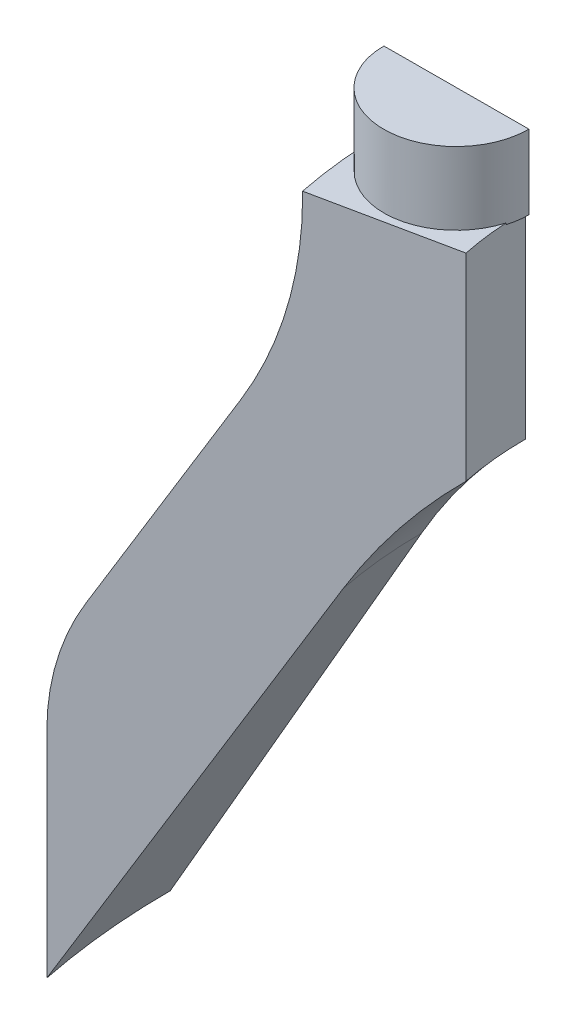
ISO-10303-21;
HEADER;
FILE_DESCRIPTION(('STEP AP214'),'2;1');
FILE_NAME('part.step','',(''),(''),'','','');
FILE_SCHEMA(('AUTOMOTIVE_DESIGN { 1 0 10303 214 1 1 1 1 }'));
ENDSEC;
DATA;
#1=APPLICATION_CONTEXT('core data for automotive mechanical design processes');
#2=APPLICATION_PROTOCOL_DEFINITION('international standard','automotive_design',2000,#1);
#3=PRODUCT_CONTEXT('',#1,'mechanical');
#4=PRODUCT('Part','Part','',(#3));
#5=PRODUCT_RELATED_PRODUCT_CATEGORY('part','',(#4));
#6=PRODUCT_DEFINITION_FORMATION('','',#4);
#7=PRODUCT_DEFINITION_CONTEXT('part definition',#1,'design');
#8=PRODUCT_DEFINITION('design','',#6,#7);
#9=PRODUCT_DEFINITION_SHAPE('','',#8);
#10=(LENGTH_UNIT() NAMED_UNIT(*) SI_UNIT(.MILLI.,.METRE.));
#11=(NAMED_UNIT(*) PLANE_ANGLE_UNIT() SI_UNIT($,.RADIAN.));
#12=(NAMED_UNIT(*) SI_UNIT($,.STERADIAN.) SOLID_ANGLE_UNIT());
#13=UNCERTAINTY_MEASURE_WITH_UNIT(LENGTH_MEASURE(1.E-05),#10,'distance_accuracy_value','');
#14=(GEOMETRIC_REPRESENTATION_CONTEXT(3) GLOBAL_UNCERTAINTY_ASSIGNED_CONTEXT((#13)) GLOBAL_UNIT_ASSIGNED_CONTEXT((#10,
#11,#12)) REPRESENTATION_CONTEXT('',''));
#15=CARTESIAN_POINT('',(0.,0.,0.));
#16=DIRECTION('',(0.,0.,1.));
#17=DIRECTION('',(1.,0.,0.));
#18=AXIS2_PLACEMENT_3D('',#15,#16,#17);
#19=CARTESIAN_POINT('',(-14.0443260313393,13.952590942658,5.93340198483997));
#20=DIRECTION('',(0.199367934417198,0.,0.97992470462083));
#21=DIRECTION('',(0.97992470462083,0.,-0.199367934417198));
#22=AXIS2_PLACEMENT_3D('',#19,#20,#21);
#23=PLANE('',#22);
#24=CARTESIAN_POINT('',(-14.0443260313393,13.952590942658,5.93340198483997));
#25=DIRECTION('',(-0.199367934417198,0.,-0.97992470462083));
#26=DIRECTION('',(0.97992470462083,0.,-0.199367934417198));
#27=AXIS2_PLACEMENT_3D('',#24,#25,#26);
#28=CIRCLE('',#27,13.5);
#29=CARTESIAN_POINT('',(-0.815342518958123,13.952590942658,3.24193487020781));
#30=VERTEX_POINT('',#29);
#31=CARTESIAN_POINT('',(-2.58696094719064,7.20388016302837,3.60237471313311));
#32=VERTEX_POINT('',#31);
#33=EDGE_CURVE('E304',#30,#32,#28,.T.);
#34=ORIENTED_EDGE('',*,*,#33,.T.);
#35=DIRECTION('',(-0.489868771651852,-0.866080532447982,0.0996649280084325));
#36=VECTOR('',#35,1.);
#37=CARTESIAN_POINT('',(-2.58696094719064,7.20388016302837,3.60237471313311));
#38=LINE('',#37,#36);
#39=CARTESIAN_POINT('',(-7.02866248836264,-0.648980558796179,4.50604910503835));
#40=VERTEX_POINT('',#39);
#41=EDGE_CURVE('E328',#32,#40,#38,.T.);
#42=ORIENTED_EDGE('',*,*,#41,.T.);
#43=CARTESIAN_POINT('',(0.185234046101336,-4.89816882745189,3.03836526729699));
#44=DIRECTION('',(0.199367934417198,0.,0.97992470462083));
#45=DIRECTION('',(0.97992470462083,0.,-0.199367934417198));
#46=AXIS2_PLACEMENT_3D('',#43,#44,#45);
#47=CIRCLE('',#46,8.5);
#48=CARTESIAN_POINT('',(-8.14412594317571,-4.89816882745189,4.73299270984317));
#49=VERTEX_POINT('',#48);
#50=EDGE_CURVE('E325',#40,#49,#47,.T.);
#51=ORIENTED_EDGE('',*,*,#50,.T.);
#52=DIRECTION('',(0.,-1.,0.));
#53=VECTOR('',#52,1.);
#54=CARTESIAN_POINT('',(-8.14412594317572,-4.89816882745189,4.73299270984317));
#55=LINE('',#54,#53);
#56=CARTESIAN_POINT('',(-8.14412594317572,-12.2823034578324,4.73299270984317));
#57=VERTEX_POINT('',#56);
#58=EDGE_CURVE('E322',#49,#57,#55,.T.);
#59=ORIENTED_EDGE('',*,*,#58,.T.);
#60=DIRECTION('',(0.48986877165185,0.866080532447983,-0.0996649280084321));
#61=VECTOR('',#60,1.);
#62=CARTESIAN_POINT('',(-8.14412594317572,-12.2823034578324,4.73299270984317));
#63=LINE('',#62,#61);
#64=CARTESIAN_POINT('',(0.34778871953757,2.7312724183872,3.00529314520432));
#65=VERTEX_POINT('',#64);
#66=EDGE_CURVE('E319',#57,#65,#63,.T.);
#67=ORIENTED_EDGE('',*,*,#66,.T.);
#68=CARTESIAN_POINT('',(18.2742726721109,-7.82793160479309,-0.641891235528776));
#69=DIRECTION('',(-0.199367934417198,0.,-0.97992470462083));
#70=DIRECTION('',(0.97992470462083,0.,-0.199367934417198));
#71=AXIS2_PLACEMENT_3D('',#68,#69,#70);
#72=CIRCLE('',#71,21.1224423401291);
#73=CARTESIAN_POINT('',(3.86601856956697,7.33672211900116,2.28950119231474));
#74=VERTEX_POINT('',#73);
#75=EDGE_CURVE('E316',#65,#74,#72,.T.);
#76=ORIENTED_EDGE('',*,*,#75,.T.);
#77=DIRECTION('',(0.,1.,0.));
#78=VECTOR('',#77,1.);
#79=CARTESIAN_POINT('',(3.86601856956697,7.33672211900116,2.28950119231474));
#80=LINE('',#79,#78);
#81=CARTESIAN_POINT('',(3.86601856956696,14.1500494040971,2.28950119231474));
#82=VERTEX_POINT('',#81);
#83=EDGE_CURVE('E311',#74,#82,#80,.T.);
#84=ORIENTED_EDGE('',*,*,#83,.T.);
#85=DIRECTION('',(-0.979919727516482,-0.00318717907963364,0.199366921813874));
#86=VECTOR('',#85,1.);
#87=CARTESIAN_POINT('',(3.86601856956696,14.1500494040971,2.28950119231474));
#88=LINE('',#87,#86);
#89=CARTESIAN_POINT('',(-0.815342518958123,14.1348233241371,3.24193487020781));
#90=VERTEX_POINT('',#89);
#91=EDGE_CURVE('E309',#82,#90,#88,.T.);
#92=ORIENTED_EDGE('',*,*,#91,.T.);
#93=DIRECTION('',(0.,-1.,0.));
#94=VECTOR('',#93,1.);
#95=CARTESIAN_POINT('',(-0.815342518958123,14.1348233241371,3.24193487020781));
#96=LINE('',#95,#94);
#97=EDGE_CURVE('E306',#90,#30,#96,.T.);
#98=ORIENTED_EDGE('',*,*,#97,.T.);
#99=EDGE_LOOP('',(#34,#42,#51,#59,#67,#76,#84,#92,#98));
#100=FACE_BOUND('',#99,.T.);
#101=ADVANCED_FACE('F34',(#100),#23,.T.);
#102=CARTESIAN_POINT('',(15.1192764526186,13.952590942658,0.));
#103=DIRECTION('',(0.,1.,0.));
#104=DIRECTION('',(-1.,0.,0.));
#105=AXIS2_PLACEMENT_3D('',#102,#103,#104);
#106=TOROIDAL_SURFACE('',#105,29.7610646475562,13.5);
#107=CARTESIAN_POINT('',(-14.6417881949376,13.952590942658,0.));
#108=DIRECTION('',(0.,0.,1.));
#109=DIRECTION('',(1.,0.,0.));
#110=AXIS2_PLACEMENT_3D('',#107,#108,#109);
#111=CIRCLE('',#110,13.5);
#112=CARTESIAN_POINT('',(-2.94970100688985,7.20388016302838,0.));
#113=VERTEX_POINT('',#112);
#114=CARTESIAN_POINT('',(-1.1417881949376,13.952590942658,0.));
#115=VERTEX_POINT('',#114);
#116=EDGE_CURVE('E280',#113,#115,#111,.T.);
#117=ORIENTED_EDGE('',*,*,#116,.F.);
#118=CARTESIAN_POINT('',(15.1192764526186,7.20388016302837,0.));
#119=DIRECTION('',(0.,1.,0.));
#120=DIRECTION('',(-1.,0.,0.));
#121=AXIS2_PLACEMENT_3D('',#118,#119,#120);
#122=CIRCLE('',#121,18.0689774595085);
#123=EDGE_CURVE('E164',#113,#32,#122,.T.);
#124=ORIENTED_EDGE('',*,*,#123,.T.);
#125=ORIENTED_EDGE('',*,*,#33,.F.);
#126=CARTESIAN_POINT('',(15.1192764526186,13.952590942658,0.));
#127=DIRECTION('',(0.,1.,0.));
#128=DIRECTION('',(-1.,0.,0.));
#129=AXIS2_PLACEMENT_3D('',#126,#127,#128);
#130=CIRCLE('',#129,16.2610646475562);
#131=EDGE_CURVE('E162',#115,#30,#130,.T.);
#132=ORIENTED_EDGE('',*,*,#131,.F.);
#133=EDGE_LOOP('',(#117,#124,#125,#132));
#134=FACE_BOUND('',#133,.T.);
#135=ADVANCED_FACE('F230',(#134),#106,.F.);
#136=CARTESIAN_POINT('',(15.1192764526186,7.20388016302837,0.));
#137=DIRECTION('',(0.,-1.,0.));
#138=DIRECTION('',(1.,0.,0.));
#139=AXIS2_PLACEMENT_3D('',#136,#137,#138);
#140=CONICAL_SURFACE('',#139,18.0689774595085,0.523488507740985);
#141=DIRECTION('',(-0.499904502194789,-0.866080532447982,0.));
#142=VECTOR('',#141,1.);
#143=CARTESIAN_POINT('',(15.1192764526186,38.5082383958813,0.));
#144=LINE('',#143,#142);
#145=CARTESIAN_POINT('',(-7.48239777453657,-0.648980558796178,0.));
#146=VERTEX_POINT('',#145);
#147=EDGE_CURVE('E296',#146,#113,#144,.F.);
#148=ORIENTED_EDGE('',*,*,#147,.F.);
#149=CARTESIAN_POINT('',(15.1192764526186,-0.648980558796186,0.));
#150=DIRECTION('',(0.,1.,0.));
#151=DIRECTION('',(-1.,0.,0.));
#152=AXIS2_PLACEMENT_3D('',#149,#150,#151);
#153=CIRCLE('',#152,22.6016742271552);
#154=EDGE_CURVE('E468',#146,#40,#153,.T.);
#155=ORIENTED_EDGE('',*,*,#154,.T.);
#156=ORIENTED_EDGE('',*,*,#41,.F.);
#157=ORIENTED_EDGE('',*,*,#123,.F.);
#158=EDGE_LOOP('',(#148,#155,#156,#157));
#159=FACE_BOUND('',#158,.T.);
#160=ADVANCED_FACE('F227',(#159),#140,.T.);
#161=CARTESIAN_POINT('',(15.1192764526186,-4.8981688274519,0.));
#162=DIRECTION('',(0.,1.,0.));
#163=DIRECTION('',(-1.,0.,0.));
#164=AXIS2_PLACEMENT_3D('',#161,#162,#163);
#165=TOROIDAL_SURFACE('',#164,15.2399897013474,8.5);
#166=CARTESIAN_POINT('',(-0.120713248728728,-4.89816882745189,0.));
#167=DIRECTION('',(0.,0.,1.));
#168=DIRECTION('',(1.,0.,0.));
#169=AXIS2_PLACEMENT_3D('',#166,#167,#168);
#170=CIRCLE('',#169,8.5);
#171=CARTESIAN_POINT('',(-8.62071324872872,-4.89816882745189,0.));
#172=VERTEX_POINT('',#171);
#173=EDGE_CURVE('E293',#172,#146,#170,.F.);
#174=ORIENTED_EDGE('',*,*,#173,.F.);
#175=CARTESIAN_POINT('',(15.1192764526186,-4.8981688274519,0.));
#176=DIRECTION('',(0.,1.,0.));
#177=DIRECTION('',(-1.,0.,0.));
#178=AXIS2_PLACEMENT_3D('',#175,#176,#177);
#179=CIRCLE('',#178,23.7399897013474);
#180=EDGE_CURVE('E466',#172,#49,#179,.T.);
#181=ORIENTED_EDGE('',*,*,#180,.T.);
#182=ORIENTED_EDGE('',*,*,#50,.F.);
#183=ORIENTED_EDGE('',*,*,#154,.F.);
#184=EDGE_LOOP('',(#174,#181,#182,#183));
#185=FACE_BOUND('',#184,.T.);
#186=ADVANCED_FACE('F223',(#185),#165,.T.);
#187=CARTESIAN_POINT('',(15.1192764526186,-4.16703048843534,0.));
#188=DIRECTION('',(0.,1.,0.));
#189=DIRECTION('',(-1.,0.,0.));
#190=AXIS2_PLACEMENT_3D('',#187,#188,#189);
#191=CYLINDRICAL_SURFACE('',#190,23.7399897013474);
#192=DIRECTION('',(0.,1.,0.));
#193=VECTOR('',#192,1.);
#194=CARTESIAN_POINT('',(-8.62071324872872,-4.16703048843533,0.));
#195=LINE('',#194,#193);
#196=CARTESIAN_POINT('',(-8.62071324872873,-12.2823034578324,0.));
#197=VERTEX_POINT('',#196);
#198=EDGE_CURVE('E290',#197,#172,#195,.T.);
#199=ORIENTED_EDGE('',*,*,#198,.F.);
#200=CARTESIAN_POINT('',(15.1192764526186,-12.2823034578325,0.));
#201=DIRECTION('',(0.,1.,0.));
#202=DIRECTION('',(-1.,0.,0.));
#203=AXIS2_PLACEMENT_3D('',#200,#201,#202);
#204=CIRCLE('',#203,23.7399897013474);
#205=EDGE_CURVE('E335',#197,#57,#204,.T.);
#206=ORIENTED_EDGE('',*,*,#205,.T.);
#207=ORIENTED_EDGE('',*,*,#58,.F.);
#208=ORIENTED_EDGE('',*,*,#180,.F.);
#209=EDGE_LOOP('',(#199,#206,#207,#208));
#210=FACE_BOUND('',#209,.T.);
#211=ADVANCED_FACE('F219',(#210),#191,.T.);
#212=CARTESIAN_POINT('',(15.1192764526186,-12.2823034578325,0.));
#213=DIRECTION('',(0.,-1.,0.));
#214=DIRECTION('',(1.,0.,0.));
#215=AXIS2_PLACEMENT_3D('',#212,#213,#214);
#216=CONICAL_SURFACE('',#215,23.7399897013474,0.523488507740983);
#217=DIRECTION('',(-0.499904502194787,-0.866080532447983,0.));
#218=VECTOR('',#217,1.);
#219=CARTESIAN_POINT('',(15.1192764526186,28.8470379075332,0.));
#220=LINE('',#219,#218);
#221=CARTESIAN_POINT('',(0.0451716122914191,2.7312724183872,0.));
#222=VERTEX_POINT('',#221);
#223=EDGE_CURVE('E287',#222,#197,#220,.T.);
#224=ORIENTED_EDGE('',*,*,#223,.F.);
#225=CARTESIAN_POINT('',(15.1192764526186,2.7312724183872,0.));
#226=DIRECTION('',(0.,1.,0.));
#227=DIRECTION('',(-1.,0.,0.));
#228=AXIS2_PLACEMENT_3D('',#225,#226,#227);
#229=CIRCLE('',#228,15.0741048403272);
#230=EDGE_CURVE('E332',#222,#65,#229,.T.);
#231=ORIENTED_EDGE('',*,*,#230,.T.);
#232=ORIENTED_EDGE('',*,*,#66,.F.);
#233=ORIENTED_EDGE('',*,*,#205,.F.);
#234=EDGE_LOOP('',(#224,#231,#232,#233));
#235=FACE_BOUND('',#234,.T.);
#236=ADVANCED_FACE('F215',(#235),#216,.F.);
#237=CARTESIAN_POINT('',(15.1192764526186,-7.82793160479308,0.));
#238=DIRECTION('',(0.,1.,0.));
#239=DIRECTION('',(-1.,0.,0.));
#240=AXIS2_PLACEMENT_3D('',#237,#238,#239);
#241=DEGENERATE_TOROIDAL_SURFACE('',#240,3.21963126821365,21.1224423401291,.F.);
#242=CARTESIAN_POINT('',(18.3389077208323,-7.82793160479309,0.));
#243=DIRECTION('',(0.,0.,1.));
#244=DIRECTION('',(1.,0.,0.));
#245=AXIS2_PLACEMENT_3D('',#242,#243,#244);
#246=CIRCLE('',#245,21.1224423401291);
#247=CARTESIAN_POINT('',(3.63547792198971,7.33672211900116,0.));
#248=VERTEX_POINT('',#247);
#249=EDGE_CURVE('E284',#248,#222,#246,.T.);
#250=ORIENTED_EDGE('',*,*,#249,.F.);
#251=CARTESIAN_POINT('',(15.1192764526186,7.33672211900116,0.));
#252=DIRECTION('',(0.,1.,0.));
#253=DIRECTION('',(-1.,0.,0.));
#254=AXIS2_PLACEMENT_3D('',#251,#252,#253);
#255=CIRCLE('',#254,11.4837985306289);
#256=EDGE_CURVE('E330',#248,#74,#255,.T.);
#257=ORIENTED_EDGE('',*,*,#256,.T.);
#258=ORIENTED_EDGE('',*,*,#75,.F.);
#259=ORIENTED_EDGE('',*,*,#230,.F.);
#260=EDGE_LOOP('',(#250,#257,#258,#259));
#261=FACE_BOUND('',#260,.T.);
#262=ADVANCED_FACE('F211',(#261),#241,.T.);
#263=CARTESIAN_POINT('',(15.1192764526186,-4.16703048843534,0.));
#264=DIRECTION('',(0.,1.,0.));
#265=DIRECTION('',(-1.,0.,0.));
#266=AXIS2_PLACEMENT_3D('',#263,#264,#265);
#267=CYLINDRICAL_SURFACE('',#266,11.4837985306289);
#268=DIRECTION('',(0.,1.,0.));
#269=VECTOR('',#268,1.);
#270=CARTESIAN_POINT('',(3.6354779219897,-4.16703048843533,0.));
#271=LINE('',#270,#269);
#272=CARTESIAN_POINT('',(3.63547792198971,14.0970312821419,0.));
#273=VERTEX_POINT('',#272);
#274=EDGE_CURVE('E268',#273,#248,#271,.F.);
#275=ORIENTED_EDGE('',*,*,#274,.F.);
#276=CARTESIAN_POINT('',(15.1192764526186,14.1366480363215,0.));
#277=DIRECTION('',(0.00344977477050115,-0.999994049509312,0.));
#278=DIRECTION('',(0.999994049509312,0.00344977477050115,0.));
#279=AXIS2_PLACEMENT_3D('',#276,#277,#278);
#280=ELLIPSE('',#279,11.4838668652718,11.4837985306289);
#281=CARTESIAN_POINT('',(3.65672291104021,14.0971045730052,0.698208420547166));
#282=VERTEX_POINT('',#281);
#283=EDGE_CURVE('E156',#282,#273,#280,.T.);
#284=ORIENTED_EDGE('',*,*,#283,.F.);
#285=CARTESIAN_POINT('',(3.65672291104022,14.0971045730052,0.698208420547138));
#286=CARTESIAN_POINT('',(3.65671763983898,14.1059287118589,0.698121882751777));
#287=CARTESIAN_POINT('',(3.6567123685723,14.1147528505434,0.698035327714555));
#288=CARTESIAN_POINT('',(3.65670182590807,14.1324011275741,0.697862183156388));
#289=CARTESIAN_POINT('',(3.65669655451051,14.1412252659202,0.697775593635443));
#290=CARTESIAN_POINT('',(3.65669128304752,14.1500494040971,0.697688986872637));
#291=B_SPLINE_CURVE_WITH_KNOTS('',3,(#285,#286,#287,#288,#289,#290),.UNSPECIFIED.,.F.,.F.,(4,2,
4),(0.,0.0264736942597354,0.0529473885194714),.UNSPECIFIED.);
#292=CARTESIAN_POINT('',(3.65669128304962,14.1500494040971,0.697688986873042));
#293=VERTEX_POINT('',#292);
#294=EDGE_CURVE('E187',#282,#293,#291,.T.);
#295=ORIENTED_EDGE('',*,*,#294,.T.);
#296=CARTESIAN_POINT('',(15.1192764526186,14.1500494040971,0.));
#297=DIRECTION('',(0.,1.,0.));
#298=DIRECTION('',(-1.,0.,0.));
#299=AXIS2_PLACEMENT_3D('',#296,#297,#298);
#300=CIRCLE('',#299,11.4837985306289);
#301=EDGE_CURVE('E202',#293,#82,#300,.T.);
#302=ORIENTED_EDGE('',*,*,#301,.T.);
#303=ORIENTED_EDGE('',*,*,#83,.F.);
#304=ORIENTED_EDGE('',*,*,#256,.F.);
#305=EDGE_LOOP('',(#275,#284,#295,#302,#303,#304));
#306=FACE_BOUND('',#305,.T.);
#307=ADVANCED_FACE('F206',(#306),#267,.F.);
#308=CARTESIAN_POINT('',(15.1192764526186,14.1500494040971,0.));
#309=DIRECTION('',(0.,-1.,0.));
#310=DIRECTION('',(1.,0.,0.));
#311=AXIS2_PLACEMENT_3D('',#308,#309,#310);
#312=CONICAL_SURFACE('',#311,11.4837985306289,1.56760914231928);
#313=CARTESIAN_POINT('',(3.70872661330898,14.1502501654011,0.483963593978391));
#314=CARTESIAN_POINT('',(3.69512143370419,14.1501975459827,0.552949417201797));
#315=CARTESIAN_POINT('',(3.67859332770948,14.1501336996225,0.621355233227295));
#316=CARTESIAN_POINT('',(3.63983854826314,14.1499845388329,0.756529694868395));
#317=CARTESIAN_POINT('',(3.61761214767996,14.1498992254315,0.823298418710074));
#318=CARTESIAN_POINT('',(3.56762426409411,14.1497081781471,0.954682160759539));
#319=CARTESIAN_POINT('',(3.53986667290977,14.1496024586238,1.01929865620213));
#320=CARTESIAN_POINT('',(3.47902267781401,14.1493718963824,1.14594961093553));
#321=CARTESIAN_POINT('',(3.44593633865288,14.1492470538967,1.20798410158909));
#322=CARTESIAN_POINT('',(3.33897306200325,14.1488457701396,1.38960778391637));
#323=CARTESIAN_POINT('',(3.25737064469452,14.1485424905611,1.5047728124125));
#324=CARTESIAN_POINT('',(3.07604753373708,14.1478782203842,1.71968023258093));
#325=CARTESIAN_POINT('',(2.97633043248668,14.1475172412301,1.81942567492879));
#326=CARTESIAN_POINT('',(2.76155384301796,14.146751832364,2.00078085168342));
#327=CARTESIAN_POINT('',(2.64649404266331,14.1463474017681,2.08239021703448));
#328=CARTESIAN_POINT('',(2.40429119020176,14.1455098089904,2.22514188951392));
#329=CARTESIAN_POINT('',(2.27714623868329,14.1450766422955,2.28628097249593));
#330=CARTESIAN_POINT('',(2.01440037941292,14.144195954392,2.38634292100166));
#331=CARTESIAN_POINT('',(1.87879979773481,14.1437484337372,2.42526664262763));
#332=CARTESIAN_POINT('',(1.60299979744779,14.1428524755406,2.47979262163742));
#333=CARTESIAN_POINT('',(1.46280075040167,14.1424040380756,2.49539675855723));
#334=CARTESIAN_POINT('',(1.18177195796997,14.1415184508091,2.5028471014302));
#335=CARTESIAN_POINT('',(1.04094220916293,14.141081301069,2.4946931783434));
#336=CARTESIAN_POINT('',(0.762640556412933,14.1402292082836,2.45485704074626));
#337=CARTESIAN_POINT('',(0.62516888724508,14.1398142667887,2.42317318601114));
#338=CARTESIAN_POINT('',(0.357494185696131,14.1390162259711,2.33717412610578));
#339=CARTESIAN_POINT('',(0.227291268259442,14.1386331271518,2.28285856316391));
#340=CARTESIAN_POINT('',(-0.0221346213167079,14.1379070946838,2.15314456225611));
#341=CARTESIAN_POINT('',(-0.141358700430547,14.1375641569847,2.07774825292074));
#342=CARTESIAN_POINT('',(-0.36546345948298,14.1369253675589,1.9080060784989));
#343=CARTESIAN_POINT('',(-0.47034333288486,14.1366295184798,1.8136591486049));
#344=CARTESIAN_POINT('',(-0.662775490766124,14.1360906575898,1.6086964253335));
#345=CARTESIAN_POINT('',(-0.750327967741547,14.135847645192,1.49808081271432));
#346=CARTESIAN_POINT('',(-0.896796916288798,14.1354433377759,1.27703106877934));
#347=CARTESIAN_POINT('',(-0.957836171693532,14.1352758969565,1.16800265591048));
#348=CARTESIAN_POINT('',(-1.03667999953561,14.1350603781431,0.998655660830308));
#349=CARTESIAN_POINT('',(-1.06084571969366,14.134994469166,0.941226998274327));
#350=CARTESIAN_POINT('',(-1.10482864598556,14.1348747024078,0.824720190427643));
#351=CARTESIAN_POINT('',(-1.12464534106784,14.1348208460431,0.765641852202934));
#352=CARTESIAN_POINT('',(-1.14223309437237,14.1347730992375,0.705885082353684));
#353=B_SPLINE_CURVE_WITH_KNOTS('',3,(#313,#314,#315,#316,#317,#318,#319,#320,#321,#322,#323,
#324,#325,#326,#327,#328,#329,#330,#331,#332,#333,#334,#335,#336,#337,#338,#339,#340,#341,#342,
#343,#344,#345,#346,#347,#348,#349,#350,#351,#352),.UNSPECIFIED.,.F.,.F.,(4,2,2,2,2,2,2,2,2,2,2,
2,2,2,2,2,2,2,2,4),(0.,0.210875294626943,0.421740493168285,0.632457844767324,0.843172636106629,
1.2644258585558,1.6855956315449,2.10677397424182,2.52801862293774,2.94924703724357,
3.37044149911498,3.79163824867373,4.21286436177706,4.63409713405385,5.05528738765901,
5.47650131394946,5.89771056056604,6.27108994496157,6.45785560695896,6.64464320395044),.UNSPECIFIED.);
#354=CARTESIAN_POINT('',(-1.12374017524904,14.1348233241371,0.765920556466206));
#355=VERTEX_POINT('',#354);
#356=EDGE_CURVE('E166',#293,#355,#353,.T.);
#357=ORIENTED_EDGE('',*,*,#356,.T.);
#358=CARTESIAN_POINT('',(15.1192764526186,14.1348233241371,0.));
#359=DIRECTION('',(0.,1.,0.));
#360=DIRECTION('',(-1.,0.,0.));
#361=AXIS2_PLACEMENT_3D('',#358,#359,#360);
#362=CIRCLE('',#361,16.2610646475562);
#363=EDGE_CURVE('E161',#355,#90,#362,.T.);
#364=ORIENTED_EDGE('',*,*,#363,.T.);
#365=ORIENTED_EDGE('',*,*,#91,.F.);
#366=ORIENTED_EDGE('',*,*,#301,.F.);
#367=EDGE_LOOP('',(#357,#364,#365,#366));
#368=FACE_BOUND('',#367,.T.);
#369=ADVANCED_FACE('F203',(#368),#312,.T.);
#370=CARTESIAN_POINT('',(15.1192764526186,-4.16703048843534,0.));
#371=DIRECTION('',(0.,1.,0.));
#372=DIRECTION('',(-1.,0.,0.));
#373=AXIS2_PLACEMENT_3D('',#370,#371,#372);
#374=CYLINDRICAL_SURFACE('',#373,16.2610646475562);
#375=DIRECTION('',(0.,1.,0.));
#376=VECTOR('',#375,1.);
#377=CARTESIAN_POINT('',(-1.14178819493761,-4.16703048843533,0.));
#378=LINE('',#377,#376);
#379=CARTESIAN_POINT('',(-1.1417881949376,14.0805506919521,0.));
#380=VERTEX_POINT('',#379);
#381=EDGE_CURVE('E274',#115,#380,#378,.T.);
#382=ORIENTED_EDGE('',*,*,#381,.F.);
#383=ORIENTED_EDGE('',*,*,#131,.T.);
#384=ORIENTED_EDGE('',*,*,#97,.F.);
#385=ORIENTED_EDGE('',*,*,#363,.F.);
#386=CARTESIAN_POINT('',(-1.12374017524904,14.1348233241371,0.765920556466206));
#387=CARTESIAN_POINT('',(-1.12374552575798,14.1257882432647,0.765807087274633));
#388=CARTESIAN_POINT('',(-1.12375087640791,14.116753162748,0.76569358978383));
#389=CARTESIAN_POINT('',(-1.12376157798977,14.0986830024259,0.765466538203765));
#390=CARTESIAN_POINT('',(-1.1237669289217,14.0896479226205,0.765352984114503));
#391=CARTESIAN_POINT('',(-1.12377227999463,14.0806128431708,0.765239401726012));
#392=B_SPLINE_CURVE_WITH_KNOTS('',3,(#386,#387,#388,#389,#390,#391),.UNSPECIFIED.,.F.,.F.,(4,2,
4),(0.,0.0271073848292365,0.0542147696584726),.UNSPECIFIED.);
#393=CARTESIAN_POINT('',(-1.12377227999463,14.0806128431708,0.765239401725932));
#394=VERTEX_POINT('',#393);
#395=EDGE_CURVE('E152',#355,#394,#392,.T.);
#396=ORIENTED_EDGE('',*,*,#395,.T.);
#397=CARTESIAN_POINT('',(15.1192764526186,14.1366480363215,0.));
#398=DIRECTION('',(0.00344977477050115,-0.999994049509312,0.));
#399=DIRECTION('',(0.999994049509312,0.00344977477050115,0.));
#400=AXIS2_PLACEMENT_3D('',#397,#398,#399);
#401=ELLIPSE('',#400,16.2611614094458,16.2610646475562);
#402=EDGE_CURVE('E136',#380,#394,#401,.F.);
#403=ORIENTED_EDGE('',*,*,#402,.F.);
#404=EDGE_LOOP('',(#382,#383,#384,#385,#396,#403));
#405=FACE_BOUND('',#404,.T.);
#406=ADVANCED_FACE('F159',(#405),#374,.T.);
#407=CARTESIAN_POINT('',(1.25621537674327,14.0888233133994,0.));
#408=DIRECTION('',(0.00344977477050115,-0.999994049509312,0.));
#409=DIRECTION('',(0.999994049509312,0.00344977477050115,0.));
#410=AXIS2_PLACEMENT_3D('',#407,#408,#409);
#411=PLANE('',#410);
#412=DIRECTION('',(-0.999994049509312,-0.00344977477050115,0.));
#413=VECTOR('',#412,1.);
#414=CARTESIAN_POINT('',(1.25621537674327,14.0888233133994,0.));
#415=LINE('',#414,#413);
#416=CARTESIAN_POINT('',(-1.24376974703001,14.0801988764732,0.));
#417=VERTEX_POINT('',#416);
#418=EDGE_CURVE('E141',#380,#417,#415,.T.);
#419=ORIENTED_EDGE('',*,*,#418,.F.);
#420=ORIENTED_EDGE('',*,*,#402,.T.);
#421=CARTESIAN_POINT('',(1.25621537674327,14.0888233133994,0.));
#422=DIRECTION('',(0.00344977477050115,-0.999994049509312,0.));
#423=DIRECTION('',(0.999994049509312,0.00344977477050115,0.));
#424=AXIS2_PLACEMENT_3D('',#421,#422,#423);
#425=CIRCLE('',#424,2.5);
#426=EDGE_CURVE('E139',#394,#417,#425,.T.);
#427=ORIENTED_EDGE('',*,*,#426,.T.);
#428=EDGE_LOOP('',(#419,#420,#427));
#429=FACE_BOUND('',#428,.T.);
#430=ADVANCED_FACE('F138',(#429),#411,.T.);
#431=DIRECTION('',(-0.999994049509312,-0.00344977477050115,0.));
#432=VECTOR('',#431,1.);
#433=CARTESIAN_POINT('',(1.25621537674327,14.0888233133994,0.));
#434=LINE('',#433,#432);
#435=CARTESIAN_POINT('',(3.75620050051655,14.0974477503257,0.));
#436=VERTEX_POINT('',#435);
#437=EDGE_CURVE('E286',#436,#273,#434,.T.);
#438=ORIENTED_EDGE('',*,*,#437,.F.);
#439=EDGE_CURVE('E158',#436,#282,#425,.T.);
#440=ORIENTED_EDGE('',*,*,#439,.T.);
#441=ORIENTED_EDGE('',*,*,#283,.T.);
#442=EDGE_LOOP('',(#438,#440,#441));
#443=FACE_BOUND('',#442,.T.);
#444=ADVANCED_FACE('F183',(#443),#411,.T.);
#445=CARTESIAN_POINT('',(1.25621537674327,14.0888233133994,0.));
#446=DIRECTION('',(-0.00344977477050115,0.999994049509312,0.));
#447=DIRECTION('',(-0.999994049509312,-0.00344977477050115,0.));
#448=AXIS2_PLACEMENT_3D('',#445,#446,#447);
#449=CYLINDRICAL_SURFACE('',#448,2.5);
#450=ORIENTED_EDGE('',*,*,#439,.F.);
#451=DIRECTION('',(-0.00344977477050115,0.999994049509312,0.));
#452=VECTOR('',#451,1.);
#453=CARTESIAN_POINT('',(3.75620050051655,14.0974477503257,0.));
#454=LINE('',#453,#452);
#455=CARTESIAN_POINT('',(3.74740357485177,16.6474325765744,0.));
#456=VERTEX_POINT('',#455);
#457=EDGE_CURVE('E258',#436,#456,#454,.T.);
#458=ORIENTED_EDGE('',*,*,#457,.T.);
#459=CARTESIAN_POINT('',(1.24741845107849,16.6388081396482,0.));
#460=DIRECTION('',(0.00344977477050115,-0.999994049509312,0.));
#461=DIRECTION('',(0.999994049509312,0.00344977477050174,0.));
#462=AXIS2_PLACEMENT_3D('',#459,#460,#461);
#463=CIRCLE('',#462,2.5);
#464=CARTESIAN_POINT('',(3.55710525648486,16.6467760863304,0.956704433332143));
#465=VERTEX_POINT('',#464);
#466=EDGE_CURVE('E52',#456,#465,#463,.T.);
#467=ORIENTED_EDGE('',*,*,#466,.T.);
#468=CARTESIAN_POINT('',(1.24741845107849,16.6388081396482,0.));
#469=DIRECTION('',(0.00344977477050115,-0.999994049509312,0.));
#470=DIRECTION('',(0.923874722162623,0.00318717867289764,0.382681773332679));
#471=AXIS2_PLACEMENT_3D('',#468,#469,#470);
#472=CIRCLE('',#471,2.5);
#473=CARTESIAN_POINT('',(-1.06226840086451,16.6308401928054,0.956704320981537));
#474=VERTEX_POINT('',#473);
#475=EDGE_CURVE('E11',#465,#474,#472,.T.);
#476=ORIENTED_EDGE('',*,*,#475,.T.);
#477=CARTESIAN_POINT('',(-1.25256667269479,16.6301837027219,0.));
#478=CARTESIAN_POINT('',(-1.25256667269479,16.6301837027219,0.497278521774297));
#479=CARTESIAN_POINT('',(-1.06226840086451,16.6308401928054,0.956704320981536));
#480=B_SPLINE_CURVE_WITH_KNOTS('',2,(#477,#478,#479),.UNSPECIFIED.,.F.,.F.,(3,3),(0.,1.),.UNSPECIFIED.);
#481=CARTESIAN_POINT('',(-1.25256449414034,16.6301837102375,0.));
#482=VERTEX_POINT('',#481);
#483=EDGE_CURVE('E45',#482,#474,#480,.T.);
#484=ORIENTED_EDGE('',*,*,#483,.F.);
#485=DIRECTION('',(-0.00344977477050115,0.999994049509312,0.));
#486=VECTOR('',#485,1.);
#487=CARTESIAN_POINT('',(-1.24376974703001,14.0801988764732,0.));
#488=LINE('',#487,#486);
#489=EDGE_CURVE('E145',#482,#417,#488,.F.);
#490=ORIENTED_EDGE('',*,*,#489,.T.);
#491=ORIENTED_EDGE('',*,*,#426,.F.);
#492=ORIENTED_EDGE('',*,*,#395,.F.);
#493=ORIENTED_EDGE('',*,*,#356,.F.);
#494=ORIENTED_EDGE('',*,*,#294,.F.);
#495=EDGE_LOOP('',(#450,#458,#467,#476,#484,#490,#491,#492,#493,#494));
#496=FACE_BOUND('',#495,.T.);
#497=ADVANCED_FACE('F150',(#496),#449,.T.);
#498=CARTESIAN_POINT('',(0.0043703029241402,-0.00396974504120179,0.));
#499=DIRECTION('',(0.,0.,1.));
#500=DIRECTION('',(0.999999965521372,0.000262597134505751,0.));
#501=AXIS2_PLACEMENT_3D('',#498,#499,#500);
#502=PLANE('',#501);
#503=ORIENTED_EDGE('',*,*,#489,.F.);
#504=DIRECTION('',(0.999994049509312,0.00344977477050105,0.));
#505=VECTOR('',#504,1.);
#506=CARTESIAN_POINT('',(-0.0530283972441762,16.6343218642249,0.));
#507=LINE('',#506,#505);
#508=EDGE_CURVE('E249',#482,#456,#507,.T.);
#509=ORIENTED_EDGE('',*,*,#508,.T.);
#510=ORIENTED_EDGE('',*,*,#457,.F.);
#511=ORIENTED_EDGE('',*,*,#437,.T.);
#512=ORIENTED_EDGE('',*,*,#274,.T.);
#513=ORIENTED_EDGE('',*,*,#249,.T.);
#514=ORIENTED_EDGE('',*,*,#223,.T.);
#515=ORIENTED_EDGE('',*,*,#198,.T.);
#516=ORIENTED_EDGE('',*,*,#173,.T.);
#517=ORIENTED_EDGE('',*,*,#147,.T.);
#518=ORIENTED_EDGE('',*,*,#116,.T.);
#519=ORIENTED_EDGE('',*,*,#381,.T.);
#520=ORIENTED_EDGE('',*,*,#418,.T.);
#521=EDGE_LOOP('',(#503,#509,#510,#511,#512,#513,#514,#515,#516,#517,#518,#519,#520));
#522=FACE_BOUND('',#521,.T.);
#523=ADVANCED_FACE('F36',(#522),#502,.F.);
#524=CARTESIAN_POINT('',(-0.0573849535127821,16.6343068349976,0.));
#525=DIRECTION('',(0.00344977477050105,-0.999994049509312,0.));
#526=DIRECTION('',(0.999994049509312,0.00344977477050105,0.));
#527=AXIS2_PLACEMENT_3D('',#524,#525,#526);
#528=PLANE('',#527);
#529=ORIENTED_EDGE('',*,*,#483,.T.);
#530=ORIENTED_EDGE('',*,*,#475,.F.);
#531=ORIENTED_EDGE('',*,*,#466,.F.);
#532=ORIENTED_EDGE('',*,*,#508,.F.);
#533=EDGE_LOOP('',(#529,#530,#531,#532));
#534=FACE_BOUND('',#533,.T.);
#535=ADVANCED_FACE('F232',(#534),#528,.F.);
#536=CLOSED_SHELL('',(#101,#135,#160,#186,#211,#236,#262,#307,#369,#406,#430,#444,#497,#523,#535));
#537=MANIFOLD_SOLID_BREP('B2',#536);
#538=ADVANCED_BREP_SHAPE_REPRESENTATION('',(#18,#537),#14);
#539=SHAPE_DEFINITION_REPRESENTATION(#9,#538);
ENDSEC;
END-ISO-10303-21;
